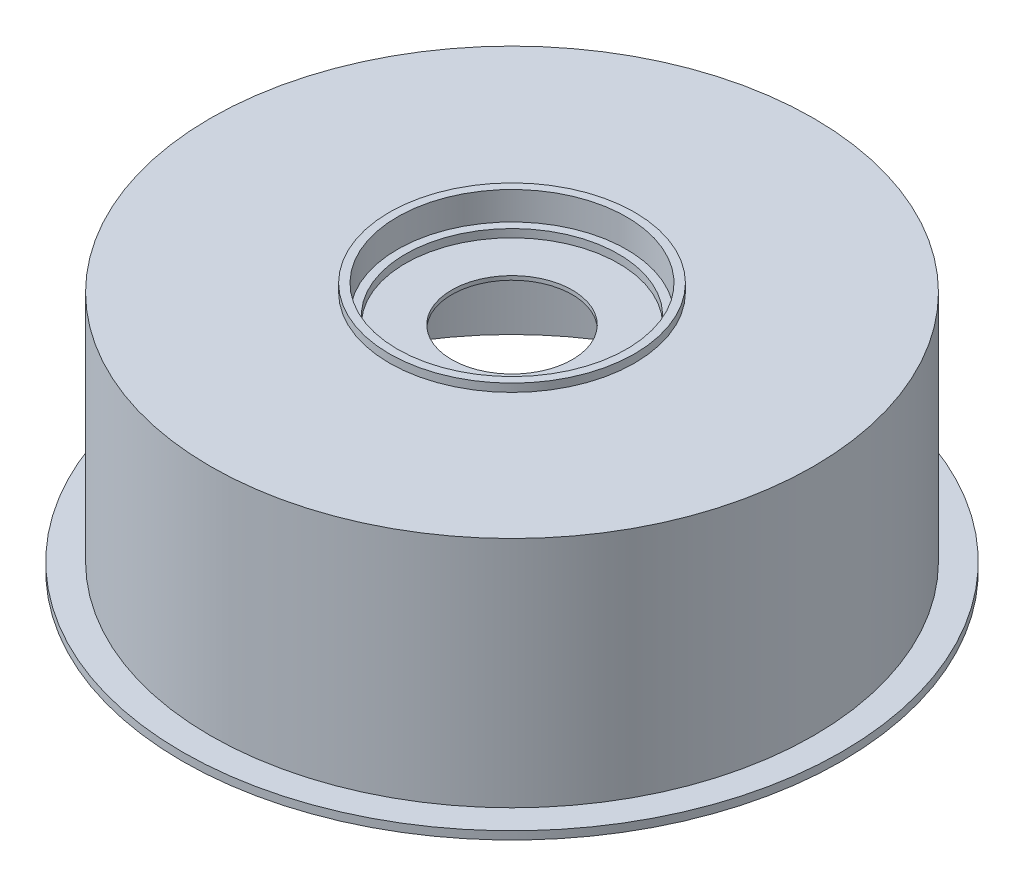
ISO-10303-21;
HEADER;
FILE_DESCRIPTION(('STEP AP214'),'2;1');
FILE_NAME('part.step','',(''),(''),'','','');
FILE_SCHEMA(('AUTOMOTIVE_DESIGN { 1 0 10303 214 1 1 1 1 }'));
ENDSEC;
DATA;
#1=APPLICATION_CONTEXT('core data for automotive mechanical design processes');
#2=APPLICATION_PROTOCOL_DEFINITION('international standard','automotive_design',2000,#1);
#3=PRODUCT_CONTEXT('',#1,'mechanical');
#4=PRODUCT('Part','Part','',(#3));
#5=PRODUCT_RELATED_PRODUCT_CATEGORY('part','',(#4));
#6=PRODUCT_DEFINITION_FORMATION('','',#4);
#7=PRODUCT_DEFINITION_CONTEXT('part definition',#1,'design');
#8=PRODUCT_DEFINITION('design','',#6,#7);
#9=PRODUCT_DEFINITION_SHAPE('','',#8);
#10=(LENGTH_UNIT() NAMED_UNIT(*) SI_UNIT(.MILLI.,.METRE.));
#11=(NAMED_UNIT(*) PLANE_ANGLE_UNIT() SI_UNIT($,.RADIAN.));
#12=(NAMED_UNIT(*) SI_UNIT($,.STERADIAN.) SOLID_ANGLE_UNIT());
#13=UNCERTAINTY_MEASURE_WITH_UNIT(LENGTH_MEASURE(1.E-05),#10,'distance_accuracy_value','');
#14=(GEOMETRIC_REPRESENTATION_CONTEXT(3) GLOBAL_UNCERTAINTY_ASSIGNED_CONTEXT((#13)) GLOBAL_UNIT_ASSIGNED_CONTEXT((#10,
#11,#12)) REPRESENTATION_CONTEXT('',''));
#15=CARTESIAN_POINT('',(0.,0.,0.));
#16=DIRECTION('',(0.,0.,1.));
#17=DIRECTION('',(1.,0.,0.));
#18=AXIS2_PLACEMENT_3D('',#15,#16,#17);
#19=CARTESIAN_POINT('',(57.,-17.7,0.));
#20=DIRECTION('',(1.,0.,0.));
#21=DIRECTION('',(0.,0.,-1.));
#22=AXIS2_PLACEMENT_3D('',#19,#20,#21);
#23=PLANE('',#22);
#24=DIRECTION('',(0.,0.,-1.));
#25=VECTOR('',#24,1.);
#26=CARTESIAN_POINT('',(57.,0.,0.));
#27=LINE('',#26,#25);
#28=CARTESIAN_POINT('',(57.,0.,25.5));
#29=VERTEX_POINT('',#28);
#30=CARTESIAN_POINT('',(57.,0.,-25.5));
#31=VERTEX_POINT('',#30);
#32=EDGE_CURVE('E115',#29,#31,#27,.T.);
#33=ORIENTED_EDGE('',*,*,#32,.T.);
#34=DIRECTION('',(0.,1.,0.));
#35=VECTOR('',#34,1.);
#36=CARTESIAN_POINT('',(57.,-17.7,-25.5));
#37=LINE('',#36,#35);
#38=CARTESIAN_POINT('',(57.,-17.7,-25.5));
#39=VERTEX_POINT('',#38);
#40=EDGE_CURVE('E12',#39,#31,#37,.T.);
#41=ORIENTED_EDGE('',*,*,#40,.F.);
#42=DIRECTION('',(0.,0.,-1.));
#43=VECTOR('',#42,1.);
#44=CARTESIAN_POINT('',(57.,-17.7,0.));
#45=LINE('',#44,#43);
#46=CARTESIAN_POINT('',(57.,-17.7,25.5));
#47=VERTEX_POINT('',#46);
#48=EDGE_CURVE('E101',#47,#39,#45,.T.);
#49=ORIENTED_EDGE('',*,*,#48,.F.);
#50=DIRECTION('',(0.,1.,0.));
#51=VECTOR('',#50,1.);
#52=CARTESIAN_POINT('',(57.,-17.7,25.5));
#53=LINE('',#52,#51);
#54=EDGE_CURVE('E68',#47,#29,#53,.T.);
#55=ORIENTED_EDGE('',*,*,#54,.T.);
#56=EDGE_LOOP('',(#33,#41,#49,#55));
#57=FACE_BOUND('',#56,.T.);
#58=ADVANCED_FACE('F52',(#57),#23,.F.);
#59=CARTESIAN_POINT('',(0.,-17.7,-25.5));
#60=DIRECTION('',(0.,0.,1.));
#61=DIRECTION('',(1.,0.,0.));
#62=AXIS2_PLACEMENT_3D('',#59,#60,#61);
#63=PLANE('',#62);
#64=DIRECTION('',(1.,0.,0.));
#65=VECTOR('',#64,1.);
#66=CARTESIAN_POINT('',(0.,0.,-25.5));
#67=LINE('',#66,#65);
#68=CARTESIAN_POINT('',(67.3331270623903,0.,-25.5));
#69=VERTEX_POINT('',#68);
#70=EDGE_CURVE('E106',#31,#69,#67,.T.);
#71=ORIENTED_EDGE('',*,*,#70,.T.);
#72=DIRECTION('',(0.,1.,0.));
#73=VECTOR('',#72,1.);
#74=CARTESIAN_POINT('',(67.3331270623903,-17.7,-25.5));
#75=LINE('',#74,#73);
#76=CARTESIAN_POINT('',(67.3331270623903,-17.7,-25.5));
#77=VERTEX_POINT('',#76);
#78=EDGE_CURVE('E60',#77,#69,#75,.T.);
#79=ORIENTED_EDGE('',*,*,#78,.F.);
#80=DIRECTION('',(1.,0.,0.));
#81=VECTOR('',#80,1.);
#82=CARTESIAN_POINT('',(0.,-17.7,-25.5));
#83=LINE('',#82,#81);
#84=EDGE_CURVE('E94',#39,#77,#83,.T.);
#85=ORIENTED_EDGE('',*,*,#84,.F.);
#86=ORIENTED_EDGE('',*,*,#40,.T.);
#87=EDGE_LOOP('',(#71,#79,#85,#86));
#88=FACE_BOUND('',#87,.T.);
#89=ADVANCED_FACE('F105',(#88),#63,.F.);
#90=CARTESIAN_POINT('',(0.,-17.7,0.));
#91=DIRECTION('',(0.,1.,0.));
#92=DIRECTION('',(0.,0.,1.));
#93=AXIS2_PLACEMENT_3D('',#90,#91,#92);
#94=CYLINDRICAL_SURFACE('',#93,72.);
#95=CARTESIAN_POINT('',(0.,0.,0.));
#96=DIRECTION('',(0.,-1.,0.));
#97=DIRECTION('',(0.,0.,-1.));
#98=AXIS2_PLACEMENT_3D('',#95,#96,#97);
#99=CIRCLE('',#98,72.);
#100=CARTESIAN_POINT('',(67.3331270623903,0.,25.5));
#101=VERTEX_POINT('',#100);
#102=EDGE_CURVE('E119',#69,#101,#99,.T.);
#103=ORIENTED_EDGE('',*,*,#102,.T.);
#104=DIRECTION('',(0.,1.,0.));
#105=VECTOR('',#104,1.);
#106=CARTESIAN_POINT('',(67.3331270623903,-17.7,25.5));
#107=LINE('',#106,#105);
#108=CARTESIAN_POINT('',(67.3331270623903,-17.7,25.5));
#109=VERTEX_POINT('',#108);
#110=EDGE_CURVE('E83',#109,#101,#107,.T.);
#111=ORIENTED_EDGE('',*,*,#110,.F.);
#112=CARTESIAN_POINT('',(0.,-17.7,0.));
#113=DIRECTION('',(0.,-1.,0.));
#114=DIRECTION('',(0.,0.,-1.));
#115=AXIS2_PLACEMENT_3D('',#112,#113,#114);
#116=CIRCLE('',#115,72.);
#117=EDGE_CURVE('E100',#77,#109,#116,.T.);
#118=ORIENTED_EDGE('',*,*,#117,.F.);
#119=ORIENTED_EDGE('',*,*,#78,.T.);
#120=EDGE_LOOP('',(#103,#111,#118,#119));
#121=FACE_BOUND('',#120,.T.);
#122=ADVANCED_FACE('F109',(#121),#94,.T.);
#123=CARTESIAN_POINT('',(0.,-17.7,25.5));
#124=DIRECTION('',(0.,0.,1.));
#125=DIRECTION('',(1.,0.,0.));
#126=AXIS2_PLACEMENT_3D('',#123,#124,#125);
#127=PLANE('',#126);
#128=DIRECTION('',(1.,0.,0.));
#129=VECTOR('',#128,1.);
#130=CARTESIAN_POINT('',(0.,0.,25.5));
#131=LINE('',#130,#129);
#132=EDGE_CURVE('E121',#29,#101,#131,.T.);
#133=ORIENTED_EDGE('',*,*,#132,.F.);
#134=ORIENTED_EDGE('',*,*,#54,.F.);
#135=DIRECTION('',(1.,0.,0.));
#136=VECTOR('',#135,1.);
#137=CARTESIAN_POINT('',(0.,-17.7,25.5));
#138=LINE('',#137,#136);
#139=EDGE_CURVE('E110',#47,#109,#138,.T.);
#140=ORIENTED_EDGE('',*,*,#139,.T.);
#141=ORIENTED_EDGE('',*,*,#110,.T.);
#142=EDGE_LOOP('',(#133,#134,#140,#141));
#143=FACE_BOUND('',#142,.T.);
#144=ADVANCED_FACE('F144',(#143),#127,.T.);
#145=CARTESIAN_POINT('',(0.,-17.7,0.));
#146=DIRECTION('',(0.,-1.,0.));
#147=DIRECTION('',(0.,0.,-1.));
#148=AXIS2_PLACEMENT_3D('',#145,#146,#147);
#149=PLANE('',#148);
#150=CARTESIAN_POINT('',(62.,-17.7,15.5));
#151=DIRECTION('',(0.,-1.,0.));
#152=DIRECTION('',(0.,0.,-1.));
#153=AXIS2_PLACEMENT_3D('',#150,#151,#152);
#154=CIRCLE('',#153,1.35000000000001);
#155=CARTESIAN_POINT('',(62.,-17.7,14.15));
#156=VERTEX_POINT('',#155);
#157=EDGE_CURVE('E117',#156,#156,#154,.T.);
#158=ORIENTED_EDGE('',*,*,#157,.F.);
#159=EDGE_LOOP('',(#158));
#160=FACE_BOUND('',#159,.T.);
#161=CARTESIAN_POINT('',(62.,-17.7,-15.5));
#162=DIRECTION('',(0.,-1.,0.));
#163=DIRECTION('',(0.,0.,-1.));
#164=AXIS2_PLACEMENT_3D('',#161,#162,#163);
#165=CIRCLE('',#164,1.35000000000001);
#166=CARTESIAN_POINT('',(62.,-17.7,-16.85));
#167=VERTEX_POINT('',#166);
#168=EDGE_CURVE('E130',#167,#167,#165,.T.);
#169=ORIENTED_EDGE('',*,*,#168,.F.);
#170=EDGE_LOOP('',(#169));
#171=FACE_BOUND('',#170,.T.);
#172=ORIENTED_EDGE('',*,*,#48,.T.);
#173=ORIENTED_EDGE('',*,*,#84,.T.);
#174=ORIENTED_EDGE('',*,*,#117,.T.);
#175=ORIENTED_EDGE('',*,*,#139,.F.);
#176=EDGE_LOOP('',(#172,#173,#174,#175));
#177=FACE_BOUND('',#176,.T.);
#178=ADVANCED_FACE('F97',(#160,#171,#177),#149,.T.);
#179=CARTESIAN_POINT('',(0.,0.,0.));
#180=DIRECTION('',(0.,-1.,0.));
#181=DIRECTION('',(0.,0.,-1.));
#182=AXIS2_PLACEMENT_3D('',#179,#180,#181);
#183=PLANE('',#182);
#184=ORIENTED_EDGE('',*,*,#32,.F.);
#185=ORIENTED_EDGE('',*,*,#132,.T.);
#186=ORIENTED_EDGE('',*,*,#102,.F.);
#187=ORIENTED_EDGE('',*,*,#70,.F.);
#188=EDGE_LOOP('',(#184,#185,#186,#187));
#189=FACE_BOUND('',#188,.T.);
#190=ADVANCED_FACE('F143',(#189),#183,.F.);
#191=CARTESIAN_POINT('',(62.,-7.7,-15.5));
#192=DIRECTION('',(0.,-1.,0.));
#193=DIRECTION('',(0.,0.,-1.));
#194=AXIS2_PLACEMENT_3D('',#191,#192,#193);
#195=CYLINDRICAL_SURFACE('',#194,1.35000000000001);
#196=CARTESIAN_POINT('',(62.,-7.7,-15.5));
#197=DIRECTION('',(0.,-1.,0.));
#198=DIRECTION('',(0.,0.,-1.));
#199=AXIS2_PLACEMENT_3D('',#196,#197,#198);
#200=CIRCLE('',#199,1.35000000000001);
#201=CARTESIAN_POINT('',(62.,-7.7,-16.85));
#202=VERTEX_POINT('',#201);
#203=EDGE_CURVE('E127',#202,#202,#200,.T.);
#204=ORIENTED_EDGE('',*,*,#203,.F.);
#205=EDGE_LOOP('',(#204));
#206=FACE_BOUND('',#205,.T.);
#207=ORIENTED_EDGE('',*,*,#168,.T.);
#208=EDGE_LOOP('',(#207));
#209=FACE_BOUND('',#208,.T.);
#210=ADVANCED_FACE('F148',(#206,#209),#195,.F.);
#211=CARTESIAN_POINT('',(62.,-7.7,-15.5));
#212=DIRECTION('',(0.,-1.,0.));
#213=DIRECTION('',(0.,0.,-1.));
#214=AXIS2_PLACEMENT_3D('',#211,#212,#213);
#215=PLANE('',#214);
#216=ORIENTED_EDGE('',*,*,#203,.T.);
#217=EDGE_LOOP('',(#216));
#218=FACE_BOUND('',#217,.T.);
#219=ADVANCED_FACE('F150',(#218),#215,.T.);
#220=CARTESIAN_POINT('',(62.,-7.7,15.5));
#221=DIRECTION('',(0.,-1.,0.));
#222=DIRECTION('',(0.,0.,-1.));
#223=AXIS2_PLACEMENT_3D('',#220,#221,#222);
#224=CYLINDRICAL_SURFACE('',#223,1.35000000000001);
#225=CARTESIAN_POINT('',(62.,-7.7,15.5));
#226=DIRECTION('',(0.,-1.,0.));
#227=DIRECTION('',(0.,0.,-1.));
#228=AXIS2_PLACEMENT_3D('',#225,#226,#227);
#229=CIRCLE('',#228,1.35000000000001);
#230=CARTESIAN_POINT('',(62.,-7.7,14.15));
#231=VERTEX_POINT('',#230);
#232=EDGE_CURVE('E133',#231,#231,#229,.T.);
#233=ORIENTED_EDGE('',*,*,#232,.F.);
#234=EDGE_LOOP('',(#233));
#235=FACE_BOUND('',#234,.T.);
#236=ORIENTED_EDGE('',*,*,#157,.T.);
#237=EDGE_LOOP('',(#236));
#238=FACE_BOUND('',#237,.T.);
#239=ADVANCED_FACE('F139',(#235,#238),#224,.F.);
#240=CARTESIAN_POINT('',(62.,-7.7,15.5));
#241=DIRECTION('',(0.,-1.,0.));
#242=DIRECTION('',(0.,0.,-1.));
#243=AXIS2_PLACEMENT_3D('',#240,#241,#242);
#244=PLANE('',#243);
#245=ORIENTED_EDGE('',*,*,#232,.T.);
#246=EDGE_LOOP('',(#245));
#247=FACE_BOUND('',#246,.T.);
#248=ADVANCED_FACE('F216',(#247),#244,.T.);
#249=CLOSED_SHELL('',(#58,#89,#122,#144,#178,#190,#210,#219,#239,#248));
#250=MANIFOLD_SOLID_BREP('B2',#249);
#251=CARTESIAN_POINT('',(-57.,-17.7,0.));
#252=DIRECTION('',(1.,0.,0.));
#253=DIRECTION('',(0.,0.,-1.));
#254=AXIS2_PLACEMENT_3D('',#251,#252,#253);
#255=PLANE('',#254);
#256=DIRECTION('',(0.,0.,-1.));
#257=VECTOR('',#256,1.);
#258=CARTESIAN_POINT('',(-57.,0.,0.));
#259=LINE('',#258,#257);
#260=CARTESIAN_POINT('',(-57.,0.,25.5));
#261=VERTEX_POINT('',#260);
#262=CARTESIAN_POINT('',(-57.,0.,-25.5));
#263=VERTEX_POINT('',#262);
#264=EDGE_CURVE('E307',#261,#263,#259,.T.);
#265=ORIENTED_EDGE('',*,*,#264,.F.);
#266=DIRECTION('',(0.,1.,0.));
#267=VECTOR('',#266,1.);
#268=CARTESIAN_POINT('',(-57.,-17.7,25.5));
#269=LINE('',#268,#267);
#270=CARTESIAN_POINT('',(-57.,-17.7,25.5));
#271=VERTEX_POINT('',#270);
#272=EDGE_CURVE('E50',#271,#261,#269,.T.);
#273=ORIENTED_EDGE('',*,*,#272,.F.);
#274=DIRECTION('',(0.,0.,-1.));
#275=VECTOR('',#274,1.);
#276=CARTESIAN_POINT('',(-57.,-17.7,0.));
#277=LINE('',#276,#275);
#278=CARTESIAN_POINT('',(-57.,-17.7,-25.5));
#279=VERTEX_POINT('',#278);
#280=EDGE_CURVE('E300',#271,#279,#277,.T.);
#281=ORIENTED_EDGE('',*,*,#280,.T.);
#282=DIRECTION('',(0.,1.,0.));
#283=VECTOR('',#282,1.);
#284=CARTESIAN_POINT('',(-57.,-17.7,-25.5));
#285=LINE('',#284,#283);
#286=EDGE_CURVE('E281',#279,#263,#285,.T.);
#287=ORIENTED_EDGE('',*,*,#286,.T.);
#288=EDGE_LOOP('',(#265,#273,#281,#287));
#289=FACE_BOUND('',#288,.T.);
#290=ADVANCED_FACE('F243',(#289),#255,.T.);
#291=CARTESIAN_POINT('',(0.,-17.7,25.5));
#292=DIRECTION('',(0.,0.,1.));
#293=DIRECTION('',(1.,0.,0.));
#294=AXIS2_PLACEMENT_3D('',#291,#292,#293);
#295=PLANE('',#294);
#296=DIRECTION('',(1.,0.,0.));
#297=VECTOR('',#296,1.);
#298=CARTESIAN_POINT('',(0.,0.,25.5));
#299=LINE('',#298,#297);
#300=CARTESIAN_POINT('',(-67.3331270623903,0.,25.5));
#301=VERTEX_POINT('',#300);
#302=EDGE_CURVE('E294',#301,#261,#299,.T.);
#303=ORIENTED_EDGE('',*,*,#302,.F.);
#304=DIRECTION('',(0.,1.,0.));
#305=VECTOR('',#304,1.);
#306=CARTESIAN_POINT('',(-67.3331270623903,-17.7,25.5));
#307=LINE('',#306,#305);
#308=CARTESIAN_POINT('',(-67.3331270623903,-17.7,25.5));
#309=VERTEX_POINT('',#308);
#310=EDGE_CURVE('E251',#309,#301,#307,.T.);
#311=ORIENTED_EDGE('',*,*,#310,.F.);
#312=DIRECTION('',(1.,0.,0.));
#313=VECTOR('',#312,1.);
#314=CARTESIAN_POINT('',(0.,-17.7,25.5));
#315=LINE('',#314,#313);
#316=EDGE_CURVE('E292',#309,#271,#315,.T.);
#317=ORIENTED_EDGE('',*,*,#316,.T.);
#318=ORIENTED_EDGE('',*,*,#272,.T.);
#319=EDGE_LOOP('',(#303,#311,#317,#318));
#320=FACE_BOUND('',#319,.T.);
#321=ADVANCED_FACE('F290',(#320),#295,.T.);
#322=CARTESIAN_POINT('',(0.,-17.7,0.));
#323=DIRECTION('',(0.,1.,0.));
#324=DIRECTION('',(0.,0.,1.));
#325=AXIS2_PLACEMENT_3D('',#322,#323,#324);
#326=CYLINDRICAL_SURFACE('',#325,72.);
#327=CARTESIAN_POINT('',(0.,0.,0.));
#328=DIRECTION('',(0.,-1.,0.));
#329=DIRECTION('',(0.,0.,-1.));
#330=AXIS2_PLACEMENT_3D('',#327,#328,#329);
#331=CIRCLE('',#330,72.);
#332=CARTESIAN_POINT('',(-67.3331270623903,0.,-25.5));
#333=VERTEX_POINT('',#332);
#334=EDGE_CURVE('E274',#301,#333,#331,.T.);
#335=ORIENTED_EDGE('',*,*,#334,.T.);
#336=DIRECTION('',(0.,1.,0.));
#337=VECTOR('',#336,1.);
#338=CARTESIAN_POINT('',(-67.3331270623903,-17.7,-25.5));
#339=LINE('',#338,#337);
#340=CARTESIAN_POINT('',(-67.3331270623903,-17.7,-25.5));
#341=VERTEX_POINT('',#340);
#342=EDGE_CURVE('E295',#341,#333,#339,.T.);
#343=ORIENTED_EDGE('',*,*,#342,.F.);
#344=CARTESIAN_POINT('',(0.,-17.7,0.));
#345=DIRECTION('',(0.,-1.,0.));
#346=DIRECTION('',(0.,0.,-1.));
#347=AXIS2_PLACEMENT_3D('',#344,#345,#346);
#348=CIRCLE('',#347,72.);
#349=EDGE_CURVE('E296',#309,#341,#348,.T.);
#350=ORIENTED_EDGE('',*,*,#349,.F.);
#351=ORIENTED_EDGE('',*,*,#310,.T.);
#352=EDGE_LOOP('',(#335,#343,#350,#351));
#353=FACE_BOUND('',#352,.T.);
#354=ADVANCED_FACE('F297',(#353),#326,.T.);
#355=CARTESIAN_POINT('',(0.,-17.7,-25.5));
#356=DIRECTION('',(0.,0.,1.));
#357=DIRECTION('',(1.,0.,0.));
#358=AXIS2_PLACEMENT_3D('',#355,#356,#357);
#359=PLANE('',#358);
#360=DIRECTION('',(1.,0.,0.));
#361=VECTOR('',#360,1.);
#362=CARTESIAN_POINT('',(0.,0.,-25.5));
#363=LINE('',#362,#361);
#364=EDGE_CURVE('E302',#333,#263,#363,.T.);
#365=ORIENTED_EDGE('',*,*,#364,.T.);
#366=ORIENTED_EDGE('',*,*,#286,.F.);
#367=DIRECTION('',(1.,0.,0.));
#368=VECTOR('',#367,1.);
#369=CARTESIAN_POINT('',(0.,-17.7,-25.5));
#370=LINE('',#369,#368);
#371=EDGE_CURVE('E259',#341,#279,#370,.T.);
#372=ORIENTED_EDGE('',*,*,#371,.F.);
#373=ORIENTED_EDGE('',*,*,#342,.T.);
#374=EDGE_LOOP('',(#365,#366,#372,#373));
#375=FACE_BOUND('',#374,.T.);
#376=ADVANCED_FACE('F317',(#375),#359,.F.);
#377=CARTESIAN_POINT('',(0.,-17.7,0.));
#378=DIRECTION('',(0.,-1.,0.));
#379=DIRECTION('',(0.,0.,-1.));
#380=AXIS2_PLACEMENT_3D('',#377,#378,#379);
#381=PLANE('',#380);
#382=CARTESIAN_POINT('',(-62.,-17.7,15.5));
#383=DIRECTION('',(0.,-1.,0.));
#384=DIRECTION('',(0.,0.,-1.));
#385=AXIS2_PLACEMENT_3D('',#382,#383,#384);
#386=CIRCLE('',#385,1.35000000000001);
#387=CARTESIAN_POINT('',(-62.,-17.7,14.15));
#388=VERTEX_POINT('',#387);
#389=EDGE_CURVE('E355',#388,#388,#386,.T.);
#390=ORIENTED_EDGE('',*,*,#389,.F.);
#391=EDGE_LOOP('',(#390));
#392=FACE_BOUND('',#391,.T.);
#393=CARTESIAN_POINT('',(-62.,-17.7,-15.5));
#394=DIRECTION('',(0.,-1.,0.));
#395=DIRECTION('',(0.,0.,-1.));
#396=AXIS2_PLACEMENT_3D('',#393,#394,#395);
#397=CIRCLE('',#396,1.35000000000001);
#398=CARTESIAN_POINT('',(-62.,-17.7,-16.85));
#399=VERTEX_POINT('',#398);
#400=EDGE_CURVE('E358',#399,#399,#397,.T.);
#401=ORIENTED_EDGE('',*,*,#400,.F.);
#402=EDGE_LOOP('',(#401));
#403=FACE_BOUND('',#402,.T.);
#404=ORIENTED_EDGE('',*,*,#280,.F.);
#405=ORIENTED_EDGE('',*,*,#316,.F.);
#406=ORIENTED_EDGE('',*,*,#349,.T.);
#407=ORIENTED_EDGE('',*,*,#371,.T.);
#408=EDGE_LOOP('',(#404,#405,#406,#407));
#409=FACE_BOUND('',#408,.T.);
#410=ADVANCED_FACE('F299',(#392,#403,#409),#381,.T.);
#411=CARTESIAN_POINT('',(0.,0.,0.));
#412=DIRECTION('',(0.,-1.,0.));
#413=DIRECTION('',(0.,0.,-1.));
#414=AXIS2_PLACEMENT_3D('',#411,#412,#413);
#415=PLANE('',#414);
#416=ORIENTED_EDGE('',*,*,#264,.T.);
#417=ORIENTED_EDGE('',*,*,#364,.F.);
#418=ORIENTED_EDGE('',*,*,#334,.F.);
#419=ORIENTED_EDGE('',*,*,#302,.T.);
#420=EDGE_LOOP('',(#416,#417,#418,#419));
#421=FACE_BOUND('',#420,.T.);
#422=ADVANCED_FACE('F319',(#421),#415,.F.);
#423=CARTESIAN_POINT('',(-62.,-7.7,-15.5));
#424=DIRECTION('',(0.,-1.,0.));
#425=DIRECTION('',(0.,0.,-1.));
#426=AXIS2_PLACEMENT_3D('',#423,#424,#425);
#427=CYLINDRICAL_SURFACE('',#426,1.35000000000001);
#428=CARTESIAN_POINT('',(-62.,-7.7,-15.5));
#429=DIRECTION('',(0.,-1.,0.));
#430=DIRECTION('',(0.,0.,-1.));
#431=AXIS2_PLACEMENT_3D('',#428,#429,#430);
#432=CIRCLE('',#431,1.35000000000001);
#433=CARTESIAN_POINT('',(-62.,-7.7,-16.85));
#434=VERTEX_POINT('',#433);
#435=EDGE_CURVE('E362',#434,#434,#432,.T.);
#436=ORIENTED_EDGE('',*,*,#435,.F.);
#437=EDGE_LOOP('',(#436));
#438=FACE_BOUND('',#437,.T.);
#439=ORIENTED_EDGE('',*,*,#400,.T.);
#440=EDGE_LOOP('',(#439));
#441=FACE_BOUND('',#440,.T.);
#442=ADVANCED_FACE('F333',(#438,#441),#427,.F.);
#443=CARTESIAN_POINT('',(-62.,-7.7,-15.5));
#444=DIRECTION('',(0.,-1.,0.));
#445=DIRECTION('',(0.,0.,-1.));
#446=AXIS2_PLACEMENT_3D('',#443,#444,#445);
#447=PLANE('',#446);
#448=ORIENTED_EDGE('',*,*,#435,.T.);
#449=EDGE_LOOP('',(#448));
#450=FACE_BOUND('',#449,.T.);
#451=ADVANCED_FACE('F337',(#450),#447,.T.);
#452=CARTESIAN_POINT('',(-62.,-7.7,15.5));
#453=DIRECTION('',(0.,-1.,0.));
#454=DIRECTION('',(0.,0.,-1.));
#455=AXIS2_PLACEMENT_3D('',#452,#453,#454);
#456=CYLINDRICAL_SURFACE('',#455,1.35000000000001);
#457=CARTESIAN_POINT('',(-62.,-7.7,15.5));
#458=DIRECTION('',(0.,-1.,0.));
#459=DIRECTION('',(0.,0.,-1.));
#460=AXIS2_PLACEMENT_3D('',#457,#458,#459);
#461=CIRCLE('',#460,1.35000000000001);
#462=CARTESIAN_POINT('',(-62.,-7.7,14.15));
#463=VERTEX_POINT('',#462);
#464=EDGE_CURVE('E310',#463,#463,#461,.T.);
#465=ORIENTED_EDGE('',*,*,#464,.F.);
#466=EDGE_LOOP('',(#465));
#467=FACE_BOUND('',#466,.T.);
#468=ORIENTED_EDGE('',*,*,#389,.T.);
#469=EDGE_LOOP('',(#468));
#470=FACE_BOUND('',#469,.T.);
#471=ADVANCED_FACE('F340',(#467,#470),#456,.F.);
#472=CARTESIAN_POINT('',(-62.,-7.7,15.5));
#473=DIRECTION('',(0.,-1.,0.));
#474=DIRECTION('',(0.,0.,-1.));
#475=AXIS2_PLACEMENT_3D('',#472,#473,#474);
#476=PLANE('',#475);
#477=ORIENTED_EDGE('',*,*,#464,.T.);
#478=EDGE_LOOP('',(#477));
#479=FACE_BOUND('',#478,.T.);
#480=ADVANCED_FACE('F347',(#479),#476,.T.);
#481=CLOSED_SHELL('',(#290,#321,#354,#376,#410,#422,#442,#451,#471,#480));
#482=MANIFOLD_SOLID_BREP('B6',#481);
#483=CARTESIAN_POINT('',(0.,-50.,0.));
#484=DIRECTION('',(0.,1.,0.));
#485=DIRECTION('',(0.,0.,1.));
#486=AXIS2_PLACEMENT_3D('',#483,#484,#485);
#487=CYLINDRICAL_SURFACE('',#486,72.);
#488=CARTESIAN_POINT('',(0.,0.,0.));
#489=DIRECTION('',(0.,-1.,0.));
#490=DIRECTION('',(0.,0.,-1.));
#491=AXIS2_PLACEMENT_3D('',#488,#489,#490);
#492=CIRCLE('',#491,72.);
#493=CARTESIAN_POINT('',(0.,0.,-72.));
#494=VERTEX_POINT('',#493);
#495=EDGE_CURVE('E438',#494,#494,#492,.T.);
#496=ORIENTED_EDGE('',*,*,#495,.F.);
#497=EDGE_LOOP('',(#496));
#498=FACE_BOUND('',#497,.T.);
#499=CARTESIAN_POINT('',(0.,-52.,0.));
#500=DIRECTION('',(0.,-1.,0.));
#501=DIRECTION('',(0.,0.,-1.));
#502=AXIS2_PLACEMENT_3D('',#499,#500,#501);
#503=CIRCLE('',#502,72.);
#504=CARTESIAN_POINT('',(0.,-52.,-72.));
#505=VERTEX_POINT('',#504);
#506=EDGE_CURVE('E448',#505,#505,#503,.T.);
#507=ORIENTED_EDGE('',*,*,#506,.T.);
#508=EDGE_LOOP('',(#507));
#509=FACE_BOUND('',#508,.T.);
#510=ADVANCED_FACE('F427',(#498,#509),#487,.F.);
#511=CARTESIAN_POINT('',(0.,0.,0.));
#512=DIRECTION('',(0.,1.,0.));
#513=DIRECTION('',(0.,0.,1.));
#514=AXIS2_PLACEMENT_3D('',#511,#512,#513);
#515=PLANE('',#514);
#516=CARTESIAN_POINT('',(0.,0.,0.));
#517=DIRECTION('',(0.,1.,0.));
#518=DIRECTION('',(0.,0.,1.));
#519=AXIS2_PLACEMENT_3D('',#516,#517,#518);
#520=CIRCLE('',#519,15.);
#521=CARTESIAN_POINT('',(0.,0.,15.));
#522=VERTEX_POINT('',#521);
#523=EDGE_CURVE('E469',#522,#522,#520,.F.);
#524=ORIENTED_EDGE('',*,*,#523,.F.);
#525=EDGE_LOOP('',(#524));
#526=FACE_BOUND('',#525,.T.);
#527=ORIENTED_EDGE('',*,*,#495,.T.);
#528=EDGE_LOOP('',(#527));
#529=FACE_BOUND('',#528,.T.);
#530=ADVANCED_FACE('F512',(#526,#529),#515,.F.);
#531=CARTESIAN_POINT('',(0.,-52.,0.));
#532=DIRECTION('',(0.,-1.,0.));
#533=DIRECTION('',(0.,0.,-1.));
#534=AXIS2_PLACEMENT_3D('',#531,#532,#533);
#535=PLANE('',#534);
#536=CARTESIAN_POINT('',(0.,-52.,0.));
#537=DIRECTION('',(0.,-1.,0.));
#538=DIRECTION('',(0.,0.,-1.));
#539=AXIS2_PLACEMENT_3D('',#536,#537,#538);
#540=CIRCLE('',#539,82.);
#541=CARTESIAN_POINT('',(0.,-52.,-82.));
#542=VERTEX_POINT('',#541);
#543=EDGE_CURVE('E442',#542,#542,#540,.T.);
#544=ORIENTED_EDGE('',*,*,#543,.T.);
#545=EDGE_LOOP('',(#544));
#546=FACE_BOUND('',#545,.T.);
#547=ORIENTED_EDGE('',*,*,#506,.F.);
#548=EDGE_LOOP('',(#547));
#549=FACE_BOUND('',#548,.T.);
#550=ADVANCED_FACE('F520',(#546,#549),#535,.T.);
#551=CARTESIAN_POINT('',(0.,-50.,0.));
#552=DIRECTION('',(0.,-1.,0.));
#553=DIRECTION('',(0.,0.,-1.));
#554=AXIS2_PLACEMENT_3D('',#551,#552,#553);
#555=PLANE('',#554);
#556=CARTESIAN_POINT('',(0.,-50.,0.));
#557=DIRECTION('',(0.,-1.,0.));
#558=DIRECTION('',(0.,0.,-1.));
#559=AXIS2_PLACEMENT_3D('',#556,#557,#558);
#560=CIRCLE('',#559,75.);
#561=CARTESIAN_POINT('',(0.,-50.,-75.));
#562=VERTEX_POINT('',#561);
#563=EDGE_CURVE('E434',#562,#562,#560,.T.);
#564=ORIENTED_EDGE('',*,*,#563,.T.);
#565=EDGE_LOOP('',(#564));
#566=FACE_BOUND('',#565,.T.);
#567=CARTESIAN_POINT('',(0.,-50.,0.));
#568=DIRECTION('',(0.,-1.,0.));
#569=DIRECTION('',(0.,0.,-1.));
#570=AXIS2_PLACEMENT_3D('',#567,#568,#569);
#571=CIRCLE('',#570,82.);
#572=CARTESIAN_POINT('',(0.,-50.,-82.));
#573=VERTEX_POINT('',#572);
#574=EDGE_CURVE('E445',#573,#573,#571,.T.);
#575=ORIENTED_EDGE('',*,*,#574,.F.);
#576=EDGE_LOOP('',(#575));
#577=FACE_BOUND('',#576,.T.);
#578=ADVANCED_FACE('F536',(#566,#577),#555,.F.);
#579=CARTESIAN_POINT('',(0.,-52.,0.));
#580=DIRECTION('',(0.,1.,0.));
#581=DIRECTION('',(0.,0.,1.));
#582=AXIS2_PLACEMENT_3D('',#579,#580,#581);
#583=CYLINDRICAL_SURFACE('',#582,82.);
#584=ORIENTED_EDGE('',*,*,#543,.F.);
#585=EDGE_LOOP('',(#584));
#586=FACE_BOUND('',#585,.T.);
#587=ORIENTED_EDGE('',*,*,#574,.T.);
#588=EDGE_LOOP('',(#587));
#589=FACE_BOUND('',#588,.T.);
#590=ADVANCED_FACE('F526',(#586,#589),#583,.T.);
#591=CARTESIAN_POINT('',(0.,8.,0.));
#592=DIRECTION('',(0.,1.,0.));
#593=DIRECTION('',(0.,0.,1.));
#594=AXIS2_PLACEMENT_3D('',#591,#592,#593);
#595=PLANE('',#594);
#596=CARTESIAN_POINT('',(0.,8.,0.));
#597=DIRECTION('',(0.,1.,0.));
#598=DIRECTION('',(0.,0.,1.));
#599=AXIS2_PLACEMENT_3D('',#596,#597,#598);
#600=CIRCLE('',#599,30.5);
#601=CARTESIAN_POINT('',(0.,8.,30.5));
#602=VERTEX_POINT('',#601);
#603=EDGE_CURVE('E454',#602,#602,#600,.T.);
#604=ORIENTED_EDGE('',*,*,#603,.F.);
#605=EDGE_LOOP('',(#604));
#606=FACE_BOUND('',#605,.T.);
#607=CARTESIAN_POINT('',(0.,8.,0.));
#608=DIRECTION('',(0.,1.,0.));
#609=DIRECTION('',(0.,0.,1.));
#610=AXIS2_PLACEMENT_3D('',#607,#608,#609);
#611=CIRCLE('',#610,75.);
#612=CARTESIAN_POINT('',(0.,8.,75.));
#613=VERTEX_POINT('',#612);
#614=EDGE_CURVE('E242',#613,#613,#611,.T.);
#615=ORIENTED_EDGE('',*,*,#614,.T.);
#616=EDGE_LOOP('',(#615));
#617=FACE_BOUND('',#616,.T.);
#618=ADVANCED_FACE('F528',(#606,#617),#595,.T.);
#619=CARTESIAN_POINT('',(0.,8.,0.));
#620=DIRECTION('',(0.,-1.,0.));
#621=DIRECTION('',(0.,0.,-1.));
#622=AXIS2_PLACEMENT_3D('',#619,#620,#621);
#623=CYLINDRICAL_SURFACE('',#622,75.);
#624=ORIENTED_EDGE('',*,*,#614,.F.);
#625=EDGE_LOOP('',(#624));
#626=FACE_BOUND('',#625,.T.);
#627=ORIENTED_EDGE('',*,*,#563,.F.);
#628=EDGE_LOOP('',(#627));
#629=FACE_BOUND('',#628,.T.);
#630=ADVANCED_FACE('F429',(#626,#629),#623,.T.);
#631=CARTESIAN_POINT('',(0.,10.,0.));
#632=DIRECTION('',(0.,1.,0.));
#633=DIRECTION('',(0.,0.,1.));
#634=AXIS2_PLACEMENT_3D('',#631,#632,#633);
#635=PLANE('',#634);
#636=CARTESIAN_POINT('',(0.,10.,0.));
#637=DIRECTION('',(0.,1.,0.));
#638=DIRECTION('',(0.,0.,1.));
#639=AXIS2_PLACEMENT_3D('',#636,#637,#638);
#640=CIRCLE('',#639,30.5);
#641=CARTESIAN_POINT('',(0.,10.,30.5));
#642=VERTEX_POINT('',#641);
#643=EDGE_CURVE('E453',#642,#642,#640,.T.);
#644=ORIENTED_EDGE('',*,*,#643,.T.);
#645=EDGE_LOOP('',(#644));
#646=FACE_BOUND('',#645,.T.);
#647=CARTESIAN_POINT('',(0.,10.,0.));
#648=DIRECTION('',(0.,1.,0.));
#649=DIRECTION('',(0.,0.,1.));
#650=AXIS2_PLACEMENT_3D('',#647,#648,#649);
#651=CIRCLE('',#650,28.5);
#652=CARTESIAN_POINT('',(0.,10.,28.5));
#653=VERTEX_POINT('',#652);
#654=EDGE_CURVE('E457',#653,#653,#651,.T.);
#655=ORIENTED_EDGE('',*,*,#654,.F.);
#656=EDGE_LOOP('',(#655));
#657=FACE_BOUND('',#656,.T.);
#658=ADVANCED_FACE('F507',(#646,#657),#635,.T.);
#659=CARTESIAN_POINT('',(0.,10.,0.));
#660=DIRECTION('',(0.,-1.,0.));
#661=DIRECTION('',(0.,0.,-1.));
#662=AXIS2_PLACEMENT_3D('',#659,#660,#661);
#663=CYLINDRICAL_SURFACE('',#662,30.5);
#664=ORIENTED_EDGE('',*,*,#643,.F.);
#665=EDGE_LOOP('',(#664));
#666=FACE_BOUND('',#665,.T.);
#667=ORIENTED_EDGE('',*,*,#603,.T.);
#668=EDGE_LOOP('',(#667));
#669=FACE_BOUND('',#668,.T.);
#670=ADVANCED_FACE('F501',(#666,#669),#663,.T.);
#671=CARTESIAN_POINT('',(0.,10.,0.));
#672=DIRECTION('',(0.,-1.,0.));
#673=DIRECTION('',(0.,0.,-1.));
#674=AXIS2_PLACEMENT_3D('',#671,#672,#673);
#675=CYLINDRICAL_SURFACE('',#674,28.5);
#676=ORIENTED_EDGE('',*,*,#654,.T.);
#677=EDGE_LOOP('',(#676));
#678=FACE_BOUND('',#677,.T.);
#679=CARTESIAN_POINT('',(0.,3.,0.));
#680=DIRECTION('',(0.,1.,0.));
#681=DIRECTION('',(0.,0.,1.));
#682=AXIS2_PLACEMENT_3D('',#679,#680,#681);
#683=CIRCLE('',#682,28.5);
#684=CARTESIAN_POINT('',(0.,3.,28.5));
#685=VERTEX_POINT('',#684);
#686=EDGE_CURVE('E462',#685,#685,#683,.T.);
#687=ORIENTED_EDGE('',*,*,#686,.F.);
#688=EDGE_LOOP('',(#687));
#689=FACE_BOUND('',#688,.T.);
#690=ADVANCED_FACE('F496',(#678,#689),#675,.F.);
#691=CARTESIAN_POINT('',(0.,3.,0.));
#692=DIRECTION('',(0.,1.,0.));
#693=DIRECTION('',(0.,0.,1.));
#694=AXIS2_PLACEMENT_3D('',#691,#692,#693);
#695=PLANE('',#694);
#696=CARTESIAN_POINT('',(0.,3.,0.));
#697=DIRECTION('',(0.,1.,0.));
#698=DIRECTION('',(0.,0.,1.));
#699=AXIS2_PLACEMENT_3D('',#696,#697,#698);
#700=CIRCLE('',#699,26.5);
#701=CARTESIAN_POINT('',(0.,3.,26.5));
#702=VERTEX_POINT('',#701);
#703=EDGE_CURVE('E466',#702,#702,#700,.T.);
#704=ORIENTED_EDGE('',*,*,#703,.F.);
#705=EDGE_LOOP('',(#704));
#706=FACE_BOUND('',#705,.T.);
#707=ORIENTED_EDGE('',*,*,#686,.T.);
#708=EDGE_LOOP('',(#707));
#709=FACE_BOUND('',#708,.T.);
#710=ADVANCED_FACE('F490',(#706,#709),#695,.T.);
#711=CARTESIAN_POINT('',(0.,1.,0.));
#712=DIRECTION('',(0.,1.,0.));
#713=DIRECTION('',(0.,0.,1.));
#714=AXIS2_PLACEMENT_3D('',#711,#712,#713);
#715=CYLINDRICAL_SURFACE('',#714,26.5);
#716=CARTESIAN_POINT('',(0.,1.,0.));
#717=DIRECTION('',(0.,1.,0.));
#718=DIRECTION('',(0.,0.,1.));
#719=AXIS2_PLACEMENT_3D('',#716,#717,#718);
#720=CIRCLE('',#719,26.5);
#721=CARTESIAN_POINT('',(0.,1.,26.5));
#722=VERTEX_POINT('',#721);
#723=EDGE_CURVE('E465',#722,#722,#720,.T.);
#724=ORIENTED_EDGE('',*,*,#723,.F.);
#725=EDGE_LOOP('',(#724));
#726=FACE_BOUND('',#725,.T.);
#727=ORIENTED_EDGE('',*,*,#703,.T.);
#728=EDGE_LOOP('',(#727));
#729=FACE_BOUND('',#728,.T.);
#730=ADVANCED_FACE('F484',(#726,#729),#715,.F.);
#731=CARTESIAN_POINT('',(0.,1.,0.));
#732=DIRECTION('',(0.,1.,0.));
#733=DIRECTION('',(0.,0.,1.));
#734=AXIS2_PLACEMENT_3D('',#731,#732,#733);
#735=PLANE('',#734);
#736=CARTESIAN_POINT('',(0.,1.,0.));
#737=DIRECTION('',(0.,1.,0.));
#738=DIRECTION('',(0.,0.,1.));
#739=AXIS2_PLACEMENT_3D('',#736,#737,#738);
#740=CIRCLE('',#739,15.);
#741=CARTESIAN_POINT('',(0.,1.,15.));
#742=VERTEX_POINT('',#741);
#743=EDGE_CURVE('E474',#742,#742,#740,.T.);
#744=ORIENTED_EDGE('',*,*,#743,.F.);
#745=EDGE_LOOP('',(#744));
#746=FACE_BOUND('',#745,.T.);
#747=ORIENTED_EDGE('',*,*,#723,.T.);
#748=EDGE_LOOP('',(#747));
#749=FACE_BOUND('',#748,.T.);
#750=ADVANCED_FACE('F481',(#746,#749),#735,.T.);
#751=CARTESIAN_POINT('',(0.,-52.001,0.));
#752=DIRECTION('',(0.,1.,0.));
#753=DIRECTION('',(0.,0.,1.));
#754=AXIS2_PLACEMENT_3D('',#751,#752,#753);
#755=CYLINDRICAL_SURFACE('',#754,15.);
#756=ORIENTED_EDGE('',*,*,#743,.T.);
#757=EDGE_LOOP('',(#756));
#758=FACE_BOUND('',#757,.T.);
#759=ORIENTED_EDGE('',*,*,#523,.T.);
#760=EDGE_LOOP('',(#759));
#761=FACE_BOUND('',#760,.T.);
#762=ADVANCED_FACE('F478',(#758,#761),#755,.F.);
#763=CLOSED_SHELL('',(#510,#530,#550,#578,#590,#618,#630,#658,#670,#690,#710,#730,#750,#762));
#764=MANIFOLD_SOLID_BREP('B44',#763);
#765=ADVANCED_BREP_SHAPE_REPRESENTATION('',(#18,#250,#482,#764),#14);
#766=SHAPE_DEFINITION_REPRESENTATION(#9,#765);
ENDSEC;
END-ISO-10303-21;
